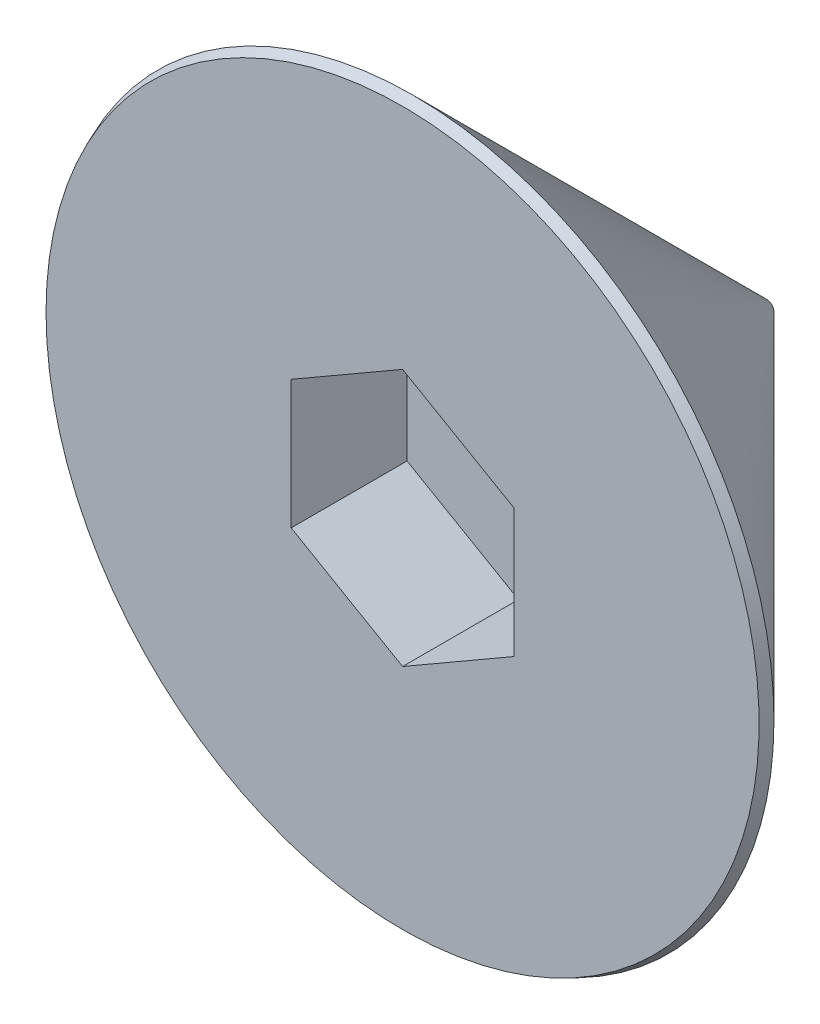
ISO-10303-21;
HEADER;
FILE_DESCRIPTION(('STEP AP214'),'2;1');
FILE_NAME('part.step','',(''),(''),'','','');
FILE_SCHEMA(('AUTOMOTIVE_DESIGN { 1 0 10303 214 1 1 1 1 }'));
ENDSEC;
DATA;
#1=APPLICATION_CONTEXT('core data for automotive mechanical design processes');
#2=APPLICATION_PROTOCOL_DEFINITION('international standard','automotive_design',2000,#1);
#3=PRODUCT_CONTEXT('',#1,'mechanical');
#4=PRODUCT('Part','Part','',(#3));
#5=PRODUCT_RELATED_PRODUCT_CATEGORY('part','',(#4));
#6=PRODUCT_DEFINITION_FORMATION('','',#4);
#7=PRODUCT_DEFINITION_CONTEXT('part definition',#1,'design');
#8=PRODUCT_DEFINITION('design','',#6,#7);
#9=PRODUCT_DEFINITION_SHAPE('','',#8);
#10=(LENGTH_UNIT() NAMED_UNIT(*) SI_UNIT(.MILLI.,.METRE.));
#11=(NAMED_UNIT(*) PLANE_ANGLE_UNIT() SI_UNIT($,.RADIAN.));
#12=(NAMED_UNIT(*) SI_UNIT($,.STERADIAN.) SOLID_ANGLE_UNIT());
#13=UNCERTAINTY_MEASURE_WITH_UNIT(LENGTH_MEASURE(1.E-05),#10,'distance_accuracy_value','');
#14=(GEOMETRIC_REPRESENTATION_CONTEXT(3) GLOBAL_UNCERTAINTY_ASSIGNED_CONTEXT((#13)) GLOBAL_UNIT_ASSIGNED_CONTEXT((#10,
#11,#12)) REPRESENTATION_CONTEXT('',''));
#15=CARTESIAN_POINT('',(0.,0.,0.));
#16=DIRECTION('',(0.,0.,1.));
#17=DIRECTION('',(1.,0.,0.));
#18=AXIS2_PLACEMENT_3D('',#15,#16,#17);
#19=CARTESIAN_POINT('',(-16.0000000000007,-25.9807621135328,77.44));
#20=DIRECTION('',(0.,0.,-1.));
#21=DIRECTION('',(-1.,0.,0.));
#22=AXIS2_PLACEMENT_3D('',#19,#20,#21);
#23=PLANE('',#22);
#24=DIRECTION('',(0.866025403784439,0.5,0.));
#25=VECTOR('',#24,1.);
#26=CARTESIAN_POINT('',(-14.5000000000007,-26.8467875173172,77.44));
#27=LINE('',#26,#25);
#28=CARTESIAN_POINT('',(-14.5000000000007,-26.8467875173172,77.44));
#29=VERTEX_POINT('',#28);
#30=CARTESIAN_POINT('',(-13.0000000000007,-25.9807621135328,77.44));
#31=VERTEX_POINT('',#30);
#32=EDGE_CURVE('E118',#29,#31,#27,.T.);
#33=ORIENTED_EDGE('',*,*,#32,.T.);
#34=DIRECTION('',(0.,1.,0.));
#35=VECTOR('',#34,1.);
#36=CARTESIAN_POINT('',(-13.0000000000007,-25.9807621135328,77.44));
#37=LINE('',#36,#35);
#38=CARTESIAN_POINT('',(-13.0000000000007,-24.248711305964,77.44));
#39=VERTEX_POINT('',#38);
#40=EDGE_CURVE('E122',#31,#39,#37,.T.);
#41=ORIENTED_EDGE('',*,*,#40,.T.);
#42=DIRECTION('',(-0.866025403784434,0.500000000000009,0.));
#43=VECTOR('',#42,1.);
#44=CARTESIAN_POINT('',(-13.0000000000007,-24.248711305964,77.44));
#45=LINE('',#44,#43);
#46=CARTESIAN_POINT('',(-14.5000000000007,-23.3826859021795,77.44));
#47=VERTEX_POINT('',#46);
#48=EDGE_CURVE('E127',#39,#47,#45,.T.);
#49=ORIENTED_EDGE('',*,*,#48,.T.);
#50=DIRECTION('',(-0.866025403784439,-0.5,0.));
#51=VECTOR('',#50,1.);
#52=CARTESIAN_POINT('',(-14.5000000000007,-23.3826859021795,77.44));
#53=LINE('',#52,#51);
#54=CARTESIAN_POINT('',(-16.0000000000007,-24.248711305964,77.44));
#55=VERTEX_POINT('',#54);
#56=EDGE_CURVE('E83',#47,#55,#53,.T.);
#57=ORIENTED_EDGE('',*,*,#56,.T.);
#58=DIRECTION('',(0.,-1.,0.));
#59=VECTOR('',#58,1.);
#60=CARTESIAN_POINT('',(-16.0000000000007,-24.248711305964,77.44));
#61=LINE('',#60,#59);
#62=CARTESIAN_POINT('',(-16.0000000000007,-25.9807621135328,77.44));
#63=VERTEX_POINT('',#62);
#64=EDGE_CURVE('E67',#55,#63,#61,.T.);
#65=ORIENTED_EDGE('',*,*,#64,.T.);
#66=DIRECTION('',(0.866025403784434,-0.500000000000009,0.));
#67=VECTOR('',#66,1.);
#68=CARTESIAN_POINT('',(-16.0000000000007,-25.9807621135328,77.44));
#69=LINE('',#68,#67);
#70=EDGE_CURVE('E72',#63,#29,#69,.T.);
#71=ORIENTED_EDGE('',*,*,#70,.T.);
#72=EDGE_LOOP('',(#33,#41,#49,#57,#65,#71));
#73=FACE_BOUND('',#72,.T.);
#74=ADVANCED_FACE('F17',(#73),#23,.F.);
#75=CARTESIAN_POINT('',(-16.0000000000007,-25.9807621135328,79.));
#76=DIRECTION('',(-0.500000000000009,-0.866025403784434,0.));
#77=DIRECTION('',(0.866025403784434,-0.500000000000009,0.));
#78=AXIS2_PLACEMENT_3D('',#75,#76,#77);
#79=PLANE('',#78);
#80=DIRECTION('',(0.,0.,1.));
#81=VECTOR('',#80,1.);
#82=CARTESIAN_POINT('',(-16.0000000000007,-25.9807621135328,79.));
#83=LINE('',#82,#81);
#84=CARTESIAN_POINT('',(-16.0000000000007,-25.9807621135328,79.));
#85=VERTEX_POINT('',#84);
#86=EDGE_CURVE('E74',#63,#85,#83,.T.);
#87=ORIENTED_EDGE('',*,*,#86,.T.);
#88=DIRECTION('',(-0.866025403784448,0.499999999999983,0.));
#89=VECTOR('',#88,1.);
#90=CARTESIAN_POINT('',(-14.5000000000007,-26.8467875173172,79.));
#91=LINE('',#90,#89);
#92=CARTESIAN_POINT('',(-14.5000000000007,-26.8467875173172,79.));
#93=VERTEX_POINT('',#92);
#94=EDGE_CURVE('E116',#93,#85,#91,.T.);
#95=ORIENTED_EDGE('',*,*,#94,.F.);
#96=DIRECTION('',(0.,0.,1.));
#97=VECTOR('',#96,1.);
#98=CARTESIAN_POINT('',(-14.5000000000007,-26.8467875173172,79.));
#99=LINE('',#98,#97);
#100=EDGE_CURVE('E77',#93,#29,#99,.F.);
#101=ORIENTED_EDGE('',*,*,#100,.T.);
#102=ORIENTED_EDGE('',*,*,#70,.F.);
#103=EDGE_LOOP('',(#87,#95,#101,#102));
#104=FACE_BOUND('',#103,.T.);
#105=ADVANCED_FACE('F73',(#104),#79,.F.);
#106=CARTESIAN_POINT('',(-16.0000000000007,-24.248711305964,79.));
#107=DIRECTION('',(-1.,0.,0.));
#108=DIRECTION('',(0.,-1.,0.));
#109=AXIS2_PLACEMENT_3D('',#106,#107,#108);
#110=PLANE('',#109);
#111=DIRECTION('',(0.,0.,1.));
#112=VECTOR('',#111,1.);
#113=CARTESIAN_POINT('',(-16.0000000000007,-24.248711305964,79.));
#114=LINE('',#113,#112);
#115=CARTESIAN_POINT('',(-16.0000000000007,-24.248711305964,79.));
#116=VERTEX_POINT('',#115);
#117=EDGE_CURVE('E85',#55,#116,#114,.T.);
#118=ORIENTED_EDGE('',*,*,#117,.T.);
#119=DIRECTION('',(0.,1.,0.));
#120=VECTOR('',#119,1.);
#121=CARTESIAN_POINT('',(-16.0000000000007,-25.1147367097484,79.));
#122=LINE('',#121,#120);
#123=EDGE_CURVE('E89',#85,#116,#122,.T.);
#124=ORIENTED_EDGE('',*,*,#123,.F.);
#125=ORIENTED_EDGE('',*,*,#86,.F.);
#126=ORIENTED_EDGE('',*,*,#64,.F.);
#127=EDGE_LOOP('',(#118,#124,#125,#126));
#128=FACE_BOUND('',#127,.T.);
#129=ADVANCED_FACE('F87',(#128),#110,.F.);
#130=CARTESIAN_POINT('',(-14.5000000000007,-23.3826859021795,79.));
#131=DIRECTION('',(-0.5,0.866025403784439,0.));
#132=DIRECTION('',(-0.866025403784439,-0.5,0.));
#133=AXIS2_PLACEMENT_3D('',#130,#131,#132);
#134=PLANE('',#133);
#135=DIRECTION('',(0.,0.,1.));
#136=VECTOR('',#135,1.);
#137=CARTESIAN_POINT('',(-14.5000000000007,-23.3826859021795,79.));
#138=LINE('',#137,#136);
#139=CARTESIAN_POINT('',(-14.5000000000007,-23.3826859021795,79.));
#140=VERTEX_POINT('',#139);
#141=EDGE_CURVE('E129',#47,#140,#138,.T.);
#142=ORIENTED_EDGE('',*,*,#141,.T.);
#143=DIRECTION('',(0.866025403784424,0.500000000000026,0.));
#144=VECTOR('',#143,1.);
#145=CARTESIAN_POINT('',(-16.0000000000007,-24.248711305964,79.));
#146=LINE('',#145,#144);
#147=EDGE_CURVE('E112',#116,#140,#146,.T.);
#148=ORIENTED_EDGE('',*,*,#147,.F.);
#149=ORIENTED_EDGE('',*,*,#117,.F.);
#150=ORIENTED_EDGE('',*,*,#56,.F.);
#151=EDGE_LOOP('',(#142,#148,#149,#150));
#152=FACE_BOUND('',#151,.T.);
#153=ADVANCED_FACE('F133',(#152),#134,.F.);
#154=CARTESIAN_POINT('',(-13.0000000000007,-24.248711305964,79.));
#155=DIRECTION('',(0.500000000000009,0.866025403784434,0.));
#156=DIRECTION('',(-0.866025403784434,0.500000000000009,0.));
#157=AXIS2_PLACEMENT_3D('',#154,#155,#156);
#158=PLANE('',#157);
#159=DIRECTION('',(0.,0.,1.));
#160=VECTOR('',#159,1.);
#161=CARTESIAN_POINT('',(-13.0000000000007,-24.248711305964,79.));
#162=LINE('',#161,#160);
#163=CARTESIAN_POINT('',(-13.0000000000007,-24.248711305964,79.));
#164=VERTEX_POINT('',#163);
#165=EDGE_CURVE('E125',#39,#164,#162,.T.);
#166=ORIENTED_EDGE('',*,*,#165,.T.);
#167=DIRECTION('',(0.866025403784424,-0.500000000000026,0.));
#168=VECTOR('',#167,1.);
#169=CARTESIAN_POINT('',(-14.5000000000007,-23.3826859021795,79.));
#170=LINE('',#169,#168);
#171=EDGE_CURVE('E105',#140,#164,#170,.T.);
#172=ORIENTED_EDGE('',*,*,#171,.F.);
#173=ORIENTED_EDGE('',*,*,#141,.F.);
#174=ORIENTED_EDGE('',*,*,#48,.F.);
#175=EDGE_LOOP('',(#166,#172,#173,#174));
#176=FACE_BOUND('',#175,.T.);
#177=ADVANCED_FACE('F142',(#176),#158,.F.);
#178=CARTESIAN_POINT('',(-13.0000000000007,-25.9807621135328,79.));
#179=DIRECTION('',(1.,0.,0.));
#180=DIRECTION('',(0.,1.,0.));
#181=AXIS2_PLACEMENT_3D('',#178,#179,#180);
#182=PLANE('',#181);
#183=DIRECTION('',(0.,0.,1.));
#184=VECTOR('',#183,1.);
#185=CARTESIAN_POINT('',(-13.0000000000007,-25.9807621135328,79.));
#186=LINE('',#185,#184);
#187=CARTESIAN_POINT('',(-13.0000000000007,-25.9807621135328,79.));
#188=VERTEX_POINT('',#187);
#189=EDGE_CURVE('E35',#31,#188,#186,.T.);
#190=ORIENTED_EDGE('',*,*,#189,.T.);
#191=DIRECTION('',(0.,1.,0.));
#192=VECTOR('',#191,1.);
#193=CARTESIAN_POINT('',(-13.0000000000007,-25.1147367097484,79.));
#194=LINE('',#193,#192);
#195=EDGE_CURVE('E101',#164,#188,#194,.F.);
#196=ORIENTED_EDGE('',*,*,#195,.F.);
#197=ORIENTED_EDGE('',*,*,#165,.F.);
#198=ORIENTED_EDGE('',*,*,#40,.F.);
#199=EDGE_LOOP('',(#190,#196,#197,#198));
#200=FACE_BOUND('',#199,.T.);
#201=ADVANCED_FACE('F140',(#200),#182,.F.);
#202=CARTESIAN_POINT('',(-14.5000000000007,-26.8467875173172,79.));
#203=DIRECTION('',(0.5,-0.866025403784439,0.));
#204=DIRECTION('',(0.866025403784439,0.5,0.));
#205=AXIS2_PLACEMENT_3D('',#202,#203,#204);
#206=PLANE('',#205);
#207=ORIENTED_EDGE('',*,*,#100,.F.);
#208=DIRECTION('',(-0.866025403784448,-0.499999999999984,0.));
#209=VECTOR('',#208,1.);
#210=CARTESIAN_POINT('',(-13.0000000000007,-25.9807621135328,79.));
#211=LINE('',#210,#209);
#212=EDGE_CURVE('E97',#188,#93,#211,.T.);
#213=ORIENTED_EDGE('',*,*,#212,.F.);
#214=ORIENTED_EDGE('',*,*,#189,.F.);
#215=ORIENTED_EDGE('',*,*,#32,.F.);
#216=EDGE_LOOP('',(#207,#213,#214,#215));
#217=FACE_BOUND('',#216,.T.);
#218=ADVANCED_FACE('F138',(#217),#206,.F.);
#219=CARTESIAN_POINT('',(-14.5000000000007,-25.1147367097484,79.));
#220=DIRECTION('',(0.,0.,1.));
#221=DIRECTION('',(1.,0.,0.));
#222=AXIS2_PLACEMENT_3D('',#219,#220,#221);
#223=PLANE('',#222);
#224=CARTESIAN_POINT('',(-14.5000000000007,-25.1147367097484,79.0000000000077));
#225=DIRECTION('',(0.,0.,-1.));
#226=DIRECTION('',(-1.,0.,0.));
#227=AXIS2_PLACEMENT_3D('',#224,#225,#226);
#228=CIRCLE('',#227,4.79999999997428);
#229=CARTESIAN_POINT('',(-19.299999999975,-25.1147367097484,79.0000000000077));
#230=VERTEX_POINT('',#229);
#231=EDGE_CURVE('E20',#230,#230,#228,.T.);
#232=ORIENTED_EDGE('',*,*,#231,.F.);
#233=EDGE_LOOP('',(#232));
#234=FACE_BOUND('',#233,.T.);
#235=ORIENTED_EDGE('',*,*,#195,.T.);
#236=ORIENTED_EDGE('',*,*,#212,.T.);
#237=ORIENTED_EDGE('',*,*,#94,.T.);
#238=ORIENTED_EDGE('',*,*,#123,.T.);
#239=ORIENTED_EDGE('',*,*,#147,.T.);
#240=ORIENTED_EDGE('',*,*,#171,.T.);
#241=EDGE_LOOP('',(#235,#236,#237,#238,#239,#240));
#242=FACE_BOUND('',#241,.T.);
#243=ADVANCED_FACE('F136',(#234,#242),#223,.T.);
#244=CARTESIAN_POINT('',(-18.8301270189229,-27.6147367097484,74.1));
#245=DIRECTION('',(0.,0.,1.));
#246=DIRECTION('',(1.,0.,0.));
#247=AXIS2_PLACEMENT_3D('',#244,#245,#246);
#248=PLANE('',#247);
#249=CARTESIAN_POINT('',(-14.5000000000007,-25.1147367097484,74.0999999999872));
#250=DIRECTION('',(0.,0.,1.));
#251=DIRECTION('',(1.,0.,0.));
#252=AXIS2_PLACEMENT_3D('',#249,#250,#251);
#253=CIRCLE('',#252,0.100000000093906);
#254=CARTESIAN_POINT('',(-14.3999999999068,-25.1147367097484,74.0999999999872));
#255=VERTEX_POINT('',#254);
#256=EDGE_CURVE('E26',#255,#255,#253,.T.);
#257=ORIENTED_EDGE('',*,*,#256,.F.);
#258=EDGE_LOOP('',(#257));
#259=FACE_BOUND('',#258,.T.);
#260=ADVANCED_FACE('F162',(#259),#248,.F.);
#261=CARTESIAN_POINT('',(-14.5000000000007,-25.1147367097484,78.8585786437466));
#262=DIRECTION('',(0.,0.,-1.));
#263=DIRECTION('',(-1.,0.,0.));
#264=AXIS2_PLACEMENT_3D('',#261,#262,#263);
#265=CONICAL_SURFACE('',#264,4.8585786437682,0.392699081827617);
#266=ORIENTED_EDGE('',*,*,#231,.T.);
#267=EDGE_LOOP('',(#266));
#268=FACE_BOUND('',#267,.T.);
#269=CARTESIAN_POINT('',(-14.5000000000007,-25.1147367097484,78.8585786437466));
#270=DIRECTION('',(0.,0.,1.));
#271=DIRECTION('',(-0.866025403786958,-0.499999999995637,0.));
#272=AXIS2_PLACEMENT_3D('',#269,#270,#271);
#273=CIRCLE('',#272,4.85857864378601);
#274=CARTESIAN_POINT('',(-9.6414213562147,-25.1147367097484,78.8585786437466));
#275=VERTEX_POINT('',#274);
#276=EDGE_CURVE('E11',#275,#275,#273,.F.);
#277=ORIENTED_EDGE('',*,*,#276,.F.);
#278=EDGE_LOOP('',(#277));
#279=FACE_BOUND('',#278,.T.);
#280=ADVANCED_FACE('F155',(#268,#279),#265,.T.);
#281=CARTESIAN_POINT('',(-14.5000000000007,-25.1147367097484,78.8585786437466));
#282=DIRECTION('',(0.,0.,1.));
#283=DIRECTION('',(1.,0.,0.));
#284=AXIS2_PLACEMENT_3D('',#281,#282,#283);
#285=CONICAL_SURFACE('',#284,4.85857864378601,0.785398163390378);
#286=CARTESIAN_POINT('',(-9.6414213562147,-25.1147367097484,78.8585786437466));
#287=CARTESIAN_POINT('',(-9.69098988375316,-25.1147367097484,78.8090101162074));
#288=CARTESIAN_POINT('',(-9.74055841129162,-25.1147367097484,78.7594415886683));
#289=CARTESIAN_POINT('',(-9.83969546636854,-25.1147367097484,78.66030453359));
#290=CARTESIAN_POINT('',(-9.889263993907,-25.1147367097484,78.6107360060508));
#291=CARTESIAN_POINT('',(-9.98840104898392,-25.1147367097484,78.5115989509725));
#292=CARTESIAN_POINT('',(-10.0379695765224,-25.1147367097484,78.4620304234333));
#293=CARTESIAN_POINT('',(-10.1371066315993,-25.1147367097484,78.362893368355));
#294=CARTESIAN_POINT('',(-10.1866751591378,-25.1147367097484,78.3133248408158));
#295=CARTESIAN_POINT('',(-10.2858122142147,-25.1147367097484,78.2141877857375));
#296=CARTESIAN_POINT('',(-10.3353807417531,-25.1147367097484,78.1646192581984));
#297=CARTESIAN_POINT('',(-10.4345177968301,-25.1147367097484,78.06548220312));
#298=CARTESIAN_POINT('',(-10.4840863243685,-25.1147367097484,78.0159136755809));
#299=CARTESIAN_POINT('',(-10.5832233794454,-25.1147367097484,77.9167766205025));
#300=CARTESIAN_POINT('',(-10.6327919069839,-25.1147367097484,77.8672080929634));
#301=CARTESIAN_POINT('',(-10.7319289620608,-25.1147367097484,77.7680710378851));
#302=CARTESIAN_POINT('',(-10.7814974895993,-25.1147367097484,77.7185025103459));
#303=CARTESIAN_POINT('',(-10.8806345446762,-25.1147367097484,77.6193654552676));
#304=CARTESIAN_POINT('',(-10.9302030722146,-25.1147367097484,77.5697969277284));
#305=CARTESIAN_POINT('',(-11.0293401272916,-25.1147367097484,77.4706598726501));
#306=CARTESIAN_POINT('',(-11.07890865483,-25.1147367097484,77.421091345111));
#307=CARTESIAN_POINT('',(-11.1780457099069,-25.1147367097484,77.3219542900326));
#308=CARTESIAN_POINT('',(-11.2276142374454,-25.1147367097484,77.2723857624935));
#309=CARTESIAN_POINT('',(-11.3267512925223,-25.1147367097484,77.1732487074151));
#310=CARTESIAN_POINT('',(-11.3763198200608,-25.1147367097484,77.123680179876));
#311=CARTESIAN_POINT('',(-11.4754568751377,-25.1147367097484,77.0245431247977));
#312=CARTESIAN_POINT('',(-11.5250254026762,-25.1147367097484,76.9749745972585));
#313=CARTESIAN_POINT('',(-11.6241624577531,-25.1147367097484,76.8758375421802));
#314=CARTESIAN_POINT('',(-11.6737309852915,-25.1147367097484,76.826269014641));
#315=CARTESIAN_POINT('',(-11.7728680403685,-25.1147367097484,76.7271319595627));
#316=CARTESIAN_POINT('',(-11.8224365679069,-25.1147367097484,76.6775634320235));
#317=CARTESIAN_POINT('',(-11.9215736229838,-25.1147367097484,76.5784263769452));
#318=CARTESIAN_POINT('',(-11.9711421505223,-25.1147367097484,76.5288578494061));
#319=CARTESIAN_POINT('',(-12.0702792055992,-25.1147367097484,76.4297207943277));
#320=CARTESIAN_POINT('',(-12.1198477331377,-25.1147367097484,76.3801522667886));
#321=CARTESIAN_POINT('',(-12.2189847882146,-25.1147367097484,76.2810152117103));
#322=CARTESIAN_POINT('',(-12.2685533157531,-25.1147367097484,76.2314466841711));
#323=CARTESIAN_POINT('',(-12.36769037083,-25.1147367097484,76.1323096290928));
#324=CARTESIAN_POINT('',(-12.4172588983684,-25.1147367097484,76.0827411015536));
#325=CARTESIAN_POINT('',(-12.5163959534454,-25.1147367097484,75.9836040464753));
#326=CARTESIAN_POINT('',(-12.5659644809838,-25.1147367097484,75.9340355189361));
#327=CARTESIAN_POINT('',(-12.6651015360607,-25.1147367097484,75.8348984638578));
#328=CARTESIAN_POINT('',(-12.7146700635992,-25.1147367097484,75.7853299363187));
#329=CARTESIAN_POINT('',(-12.8138071186761,-25.1147367097484,75.6861928812403));
#330=CARTESIAN_POINT('',(-12.8633756462146,-25.1147367097484,75.6366243537012));
#331=CARTESIAN_POINT('',(-12.9625127012915,-25.1147367097484,75.5374872986228));
#332=CARTESIAN_POINT('',(-13.0120812288299,-25.1147367097484,75.4879187710837));
#333=CARTESIAN_POINT('',(-13.1112182839069,-25.1147367097484,75.3887817160054));
#334=CARTESIAN_POINT('',(-13.1607868114453,-25.1147367097484,75.3392131884662));
#335=CARTESIAN_POINT('',(-13.2599238665222,-25.1147367097484,75.2400761333879));
#336=CARTESIAN_POINT('',(-13.3094923940607,-25.1147367097484,75.1905076058487));
#337=CARTESIAN_POINT('',(-13.4086294491376,-25.1147367097484,75.0913705507704));
#338=CARTESIAN_POINT('',(-13.4581979766761,-25.1147367097484,75.0418020232313));
#339=CARTESIAN_POINT('',(-13.557335031753,-25.1147367097484,74.9426649681529));
#340=CARTESIAN_POINT('',(-13.6069035592915,-25.1147367097484,74.8930964406138));
#341=CARTESIAN_POINT('',(-13.7060406143684,-25.1147367097484,74.7939593855354));
#342=CARTESIAN_POINT('',(-13.7556091419068,-25.1147367097484,74.7443908579963));
#343=CARTESIAN_POINT('',(-13.8547461969838,-25.1147367097484,74.645253802918));
#344=CARTESIAN_POINT('',(-13.9043147245222,-25.1147367097484,74.5956852753788));
#345=CARTESIAN_POINT('',(-14.0034517795991,-25.1147367097484,74.4965482203005));
#346=CARTESIAN_POINT('',(-14.0530203071376,-25.1147367097484,74.4469796927613));
#347=CARTESIAN_POINT('',(-14.1521573622145,-25.1147367097484,74.347842637683));
#348=CARTESIAN_POINT('',(-14.201725889753,-25.1147367097484,74.2982741101439));
#349=CARTESIAN_POINT('',(-14.3008629448299,-25.1147367097484,74.1991370550655));
#350=CARTESIAN_POINT('',(-14.3504314723684,-25.1147367097484,74.1495685275264));
#351=CARTESIAN_POINT('',(-14.3999999999068,-25.1147367097484,74.0999999999872));
#352=B_SPLINE_CURVE_WITH_KNOTS('',3,(#286,#287,#288,#289,#290,#291,#292,#293,#294,#295,#296,
#297,#298,#299,#300,#301,#302,#303,#304,#305,#306,#307,#308,#309,#310,#311,#312,#313,#314,#315,
#316,#317,#318,#319,#320,#321,#322,#323,#324,#325,#326,#327,#328,#329,#330,#331,#332,#333,#334,
#335,#336,#337,#338,#339,#340,#341,#342,#343,#344,#345,#346,#347,#348,#349,#350,#351),
.UNSPECIFIED.,.F.,.F.,(4,2,2,2,2,2,2,2,2,2,2,2,2,2,2,2,2,2,2,2,2,2,2,2,2,2,2,2,2,2,2,2,4),(0.,
0.210301451736748,0.420602903473495,0.630904355210243,0.841205806946991,1.05150725868374,
1.26180871042049,1.47211016215724,1.68241161389398,1.89271306563073,2.10301451736748,
2.31331596910423,2.52361742084097,2.73391887257772,2.94422032431447,3.15452177605122,
3.36482322778797,3.57512467952471,3.78542613126146,3.99572758299821,4.20602903473496,
4.4163304864717,4.62663193820845,4.8369333899452,5.04723484168195,5.25753629341869,
5.46783774515544,5.67813919689219,5.88844064862894,6.09874210036568,6.30904355210243,
6.51934500383918,6.72964645557593),.UNSPECIFIED.);
#353=EDGE_CURVE('BSEAM153',#275,#255,#352,.T.);
#354=ORIENTED_EDGE('',*,*,#276,.T.);
#355=ORIENTED_EDGE('',*,*,#256,.T.);
#356=ORIENTED_EDGE('',*,*,#353,.T.);
#357=ORIENTED_EDGE('',*,*,#353,.F.);
#358=EDGE_LOOP('',(#354,#356,#355,#357));
#359=FACE_BOUND('',#358,.T.);
#360=ADVANCED_FACE('F153',(#359),#285,.T.);
#361=CLOSED_SHELL('',(#74,#105,#129,#153,#177,#201,#218,#243,#260,#280,#360));
#362=MANIFOLD_SOLID_BREP('B1',#361);
#363=ADVANCED_BREP_SHAPE_REPRESENTATION('',(#18,#362),#14);
#364=SHAPE_DEFINITION_REPRESENTATION(#9,#363);
ENDSEC;
END-ISO-10303-21;
